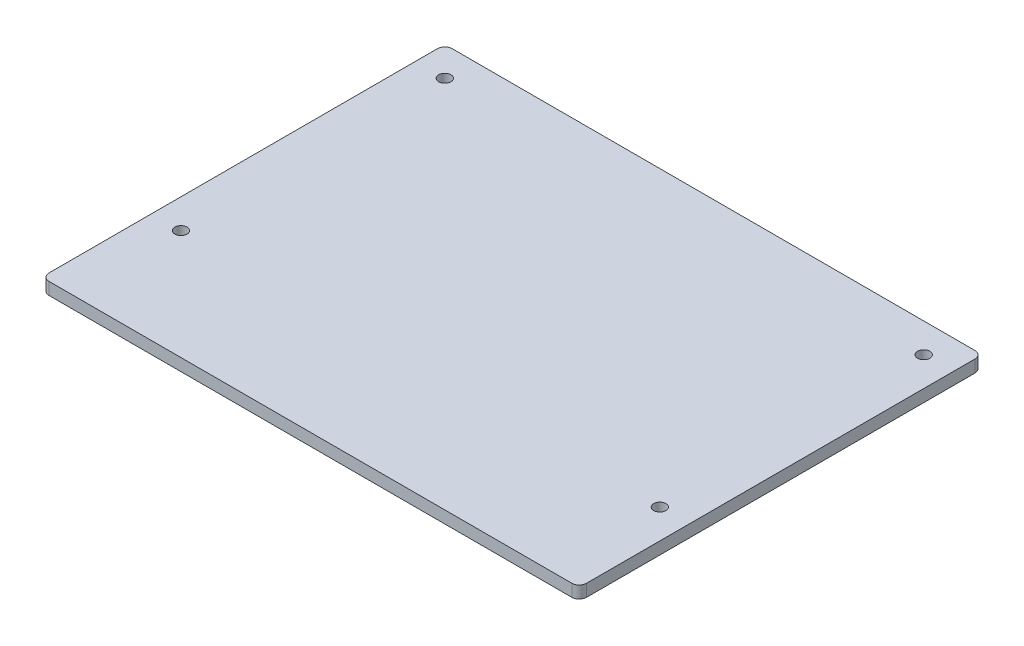
ISO-10303-21;
HEADER;
FILE_DESCRIPTION(('STEP AP214'),'2;1');
FILE_NAME('part.step','',(''),(''),'','','');
FILE_SCHEMA(('AUTOMOTIVE_DESIGN { 1 0 10303 214 1 1 1 1 }'));
ENDSEC;
DATA;
#1=APPLICATION_CONTEXT('core data for automotive mechanical design processes');
#2=APPLICATION_PROTOCOL_DEFINITION('international standard','automotive_design',2000,#1);
#3=PRODUCT_CONTEXT('',#1,'mechanical');
#4=PRODUCT('Part','Part','',(#3));
#5=PRODUCT_RELATED_PRODUCT_CATEGORY('part','',(#4));
#6=PRODUCT_DEFINITION_FORMATION('','',#4);
#7=PRODUCT_DEFINITION_CONTEXT('part definition',#1,'design');
#8=PRODUCT_DEFINITION('design','',#6,#7);
#9=PRODUCT_DEFINITION_SHAPE('','',#8);
#10=(LENGTH_UNIT() NAMED_UNIT(*) SI_UNIT(.MILLI.,.METRE.));
#11=(NAMED_UNIT(*) PLANE_ANGLE_UNIT() SI_UNIT($,.RADIAN.));
#12=(NAMED_UNIT(*) SI_UNIT($,.STERADIAN.) SOLID_ANGLE_UNIT());
#13=UNCERTAINTY_MEASURE_WITH_UNIT(LENGTH_MEASURE(1.E-05),#10,'distance_accuracy_value','');
#14=(GEOMETRIC_REPRESENTATION_CONTEXT(3) GLOBAL_UNCERTAINTY_ASSIGNED_CONTEXT((#13)) GLOBAL_UNIT_ASSIGNED_CONTEXT((#10,
#11,#12)) REPRESENTATION_CONTEXT('',''));
#15=CARTESIAN_POINT('',(0.,0.,0.));
#16=DIRECTION('',(0.,0.,1.));
#17=DIRECTION('',(1.,0.,0.));
#18=AXIS2_PLACEMENT_3D('',#15,#16,#17);
#19=CARTESIAN_POINT('',(-107.,5.,79.5));
#20=DIRECTION('',(0.,1.,0.));
#21=DIRECTION('',(0.,0.,1.));
#22=AXIS2_PLACEMENT_3D('',#19,#20,#21);
#23=PLANE('',#22);
#24=CARTESIAN_POINT('',(98.,5.,-70.5));
#25=DIRECTION('',(0.,1.,0.));
#26=DIRECTION('',(0.,0.,1.));
#27=AXIS2_PLACEMENT_3D('',#24,#25,#26);
#28=CIRCLE('',#27,2.5);
#29=CARTESIAN_POINT('',(98.,5.,-68.));
#30=VERTEX_POINT('',#29);
#31=EDGE_CURVE('E187',#30,#30,#28,.T.);
#32=ORIENTED_EDGE('',*,*,#31,.F.);
#33=EDGE_LOOP('',(#32));
#34=FACE_BOUND('',#33,.T.);
#35=CARTESIAN_POINT('',(-98.,5.,37.5));
#36=DIRECTION('',(0.,1.,0.));
#37=DIRECTION('',(0.,0.,1.));
#38=AXIS2_PLACEMENT_3D('',#35,#36,#37);
#39=CIRCLE('',#38,2.5);
#40=CARTESIAN_POINT('',(-98.,5.,40.));
#41=VERTEX_POINT('',#40);
#42=EDGE_CURVE('E133',#41,#41,#39,.T.);
#43=ORIENTED_EDGE('',*,*,#42,.F.);
#44=EDGE_LOOP('',(#43));
#45=FACE_BOUND('',#44,.T.);
#46=CARTESIAN_POINT('',(-107.,5.,79.5));
#47=DIRECTION('',(0.,1.,0.));
#48=DIRECTION('',(0.,0.,1.));
#49=AXIS2_PLACEMENT_3D('',#46,#47,#48);
#50=CIRCLE('',#49,3.);
#51=CARTESIAN_POINT('',(-110.,5.,79.5));
#52=VERTEX_POINT('',#51);
#53=CARTESIAN_POINT('',(-107.,5.,82.5));
#54=VERTEX_POINT('',#53);
#55=EDGE_CURVE('E144',#52,#54,#50,.T.);
#56=ORIENTED_EDGE('',*,*,#55,.T.);
#57=DIRECTION('',(1.,0.,0.));
#58=VECTOR('',#57,1.);
#59=CARTESIAN_POINT('',(-107.,5.,82.5));
#60=LINE('',#59,#58);
#61=CARTESIAN_POINT('',(107.,5.,82.5));
#62=VERTEX_POINT('',#61);
#63=EDGE_CURVE('E92',#54,#62,#60,.T.);
#64=ORIENTED_EDGE('',*,*,#63,.T.);
#65=CARTESIAN_POINT('',(107.,5.,79.5));
#66=DIRECTION('',(0.,1.,0.));
#67=DIRECTION('',(0.,0.,1.));
#68=AXIS2_PLACEMENT_3D('',#65,#66,#67);
#69=CIRCLE('',#68,3.);
#70=CARTESIAN_POINT('',(110.,5.,79.5));
#71=VERTEX_POINT('',#70);
#72=EDGE_CURVE('E159',#62,#71,#69,.T.);
#73=ORIENTED_EDGE('',*,*,#72,.T.);
#74=DIRECTION('',(0.,0.,-1.));
#75=VECTOR('',#74,1.);
#76=CARTESIAN_POINT('',(110.,5.,-79.5));
#77=LINE('',#76,#75);
#78=CARTESIAN_POINT('',(110.,5.,-79.5));
#79=VERTEX_POINT('',#78);
#80=EDGE_CURVE('E172',#71,#79,#77,.T.);
#81=ORIENTED_EDGE('',*,*,#80,.T.);
#82=CARTESIAN_POINT('',(107.,5.,-79.5));
#83=DIRECTION('',(0.,1.,0.));
#84=DIRECTION('',(0.,0.,1.));
#85=AXIS2_PLACEMENT_3D('',#82,#83,#84);
#86=CIRCLE('',#85,3.);
#87=CARTESIAN_POINT('',(107.,5.,-82.5));
#88=VERTEX_POINT('',#87);
#89=EDGE_CURVE('E111',#79,#88,#86,.T.);
#90=ORIENTED_EDGE('',*,*,#89,.T.);
#91=DIRECTION('',(-1.,0.,0.));
#92=VECTOR('',#91,1.);
#93=CARTESIAN_POINT('',(-107.,5.,-82.5));
#94=LINE('',#93,#92);
#95=CARTESIAN_POINT('',(-107.,5.,-82.5));
#96=VERTEX_POINT('',#95);
#97=EDGE_CURVE('E105',#88,#96,#94,.T.);
#98=ORIENTED_EDGE('',*,*,#97,.T.);
#99=CARTESIAN_POINT('',(-107.,5.,-79.5));
#100=DIRECTION('',(0.,1.,0.));
#101=DIRECTION('',(0.,0.,-1.));
#102=AXIS2_PLACEMENT_3D('',#99,#100,#101);
#103=CIRCLE('',#102,3.);
#104=CARTESIAN_POINT('',(-110.,5.,-79.5));
#105=VERTEX_POINT('',#104);
#106=EDGE_CURVE('E109',#96,#105,#103,.T.);
#107=ORIENTED_EDGE('',*,*,#106,.T.);
#108=DIRECTION('',(0.,0.,1.));
#109=VECTOR('',#108,1.);
#110=CARTESIAN_POINT('',(-110.,5.,-79.5));
#111=LINE('',#110,#109);
#112=EDGE_CURVE('E49',#105,#52,#111,.T.);
#113=ORIENTED_EDGE('',*,*,#112,.T.);
#114=EDGE_LOOP('',(#56,#64,#73,#81,#90,#98,#107,#113));
#115=FACE_BOUND('',#114,.T.);
#116=CARTESIAN_POINT('',(-98.,5.,-70.5));
#117=DIRECTION('',(0.,1.,0.));
#118=DIRECTION('',(0.,0.,-1.));
#119=AXIS2_PLACEMENT_3D('',#116,#117,#118);
#120=CIRCLE('',#119,2.50000000000001);
#121=CARTESIAN_POINT('',(-98.,5.,-73.));
#122=VERTEX_POINT('',#121);
#123=EDGE_CURVE('E181',#122,#122,#120,.T.);
#124=ORIENTED_EDGE('',*,*,#123,.F.);
#125=EDGE_LOOP('',(#124));
#126=FACE_BOUND('',#125,.T.);
#127=CARTESIAN_POINT('',(98.,5.,37.5));
#128=DIRECTION('',(0.,1.,0.));
#129=DIRECTION('',(0.,0.,-1.));
#130=AXIS2_PLACEMENT_3D('',#127,#128,#129);
#131=CIRCLE('',#130,2.5);
#132=CARTESIAN_POINT('',(98.,5.,35.));
#133=VERTEX_POINT('',#132);
#134=EDGE_CURVE('E193',#133,#133,#131,.T.);
#135=ORIENTED_EDGE('',*,*,#134,.F.);
#136=EDGE_LOOP('',(#135));
#137=FACE_BOUND('',#136,.T.);
#138=ADVANCED_FACE('F32',(#34,#45,#115,#126,#137),#23,.T.);
#139=CARTESIAN_POINT('',(-107.,0.,79.5));
#140=DIRECTION('',(0.,1.,0.));
#141=DIRECTION('',(0.,0.,1.));
#142=AXIS2_PLACEMENT_3D('',#139,#140,#141);
#143=PLANE('',#142);
#144=CARTESIAN_POINT('',(98.,0.,-70.5));
#145=DIRECTION('',(0.,1.,0.));
#146=DIRECTION('',(0.,0.,1.));
#147=AXIS2_PLACEMENT_3D('',#144,#145,#146);
#148=CIRCLE('',#147,2.5);
#149=CARTESIAN_POINT('',(98.,0.,-68.));
#150=VERTEX_POINT('',#149);
#151=EDGE_CURVE('E190',#150,#150,#148,.T.);
#152=ORIENTED_EDGE('',*,*,#151,.T.);
#153=EDGE_LOOP('',(#152));
#154=FACE_BOUND('',#153,.T.);
#155=CARTESIAN_POINT('',(-98.,0.,37.5));
#156=DIRECTION('',(0.,1.,0.));
#157=DIRECTION('',(0.,0.,1.));
#158=AXIS2_PLACEMENT_3D('',#155,#156,#157);
#159=CIRCLE('',#158,2.5);
#160=CARTESIAN_POINT('',(-98.,0.,40.));
#161=VERTEX_POINT('',#160);
#162=EDGE_CURVE('E178',#161,#161,#159,.T.);
#163=ORIENTED_EDGE('',*,*,#162,.T.);
#164=EDGE_LOOP('',(#163));
#165=FACE_BOUND('',#164,.T.);
#166=CARTESIAN_POINT('',(-107.,0.,79.5));
#167=DIRECTION('',(0.,1.,0.));
#168=DIRECTION('',(0.,0.,1.));
#169=AXIS2_PLACEMENT_3D('',#166,#167,#168);
#170=CIRCLE('',#169,3.);
#171=CARTESIAN_POINT('',(-110.,0.,79.5));
#172=VERTEX_POINT('',#171);
#173=CARTESIAN_POINT('',(-107.,0.,82.5));
#174=VERTEX_POINT('',#173);
#175=EDGE_CURVE('E129',#172,#174,#170,.T.);
#176=ORIENTED_EDGE('',*,*,#175,.F.);
#177=DIRECTION('',(0.,0.,1.));
#178=VECTOR('',#177,1.);
#179=CARTESIAN_POINT('',(-110.,0.,-79.5));
#180=LINE('',#179,#178);
#181=CARTESIAN_POINT('',(-110.,0.,-79.5));
#182=VERTEX_POINT('',#181);
#183=EDGE_CURVE('E84',#182,#172,#180,.T.);
#184=ORIENTED_EDGE('',*,*,#183,.F.);
#185=CARTESIAN_POINT('',(-107.,0.,-79.5));
#186=DIRECTION('',(0.,1.,0.));
#187=DIRECTION('',(0.,0.,-1.));
#188=AXIS2_PLACEMENT_3D('',#185,#186,#187);
#189=CIRCLE('',#188,3.);
#190=CARTESIAN_POINT('',(-107.,0.,-82.5));
#191=VERTEX_POINT('',#190);
#192=EDGE_CURVE('E78',#191,#182,#189,.T.);
#193=ORIENTED_EDGE('',*,*,#192,.F.);
#194=DIRECTION('',(-1.,0.,0.));
#195=VECTOR('',#194,1.);
#196=CARTESIAN_POINT('',(-107.,0.,-82.5));
#197=LINE('',#196,#195);
#198=CARTESIAN_POINT('',(107.,0.,-82.5));
#199=VERTEX_POINT('',#198);
#200=EDGE_CURVE('E119',#199,#191,#197,.T.);
#201=ORIENTED_EDGE('',*,*,#200,.F.);
#202=CARTESIAN_POINT('',(107.,0.,-79.5));
#203=DIRECTION('',(0.,1.,0.));
#204=DIRECTION('',(0.,0.,1.));
#205=AXIS2_PLACEMENT_3D('',#202,#203,#204);
#206=CIRCLE('',#205,3.);
#207=CARTESIAN_POINT('',(110.,0.,-79.5));
#208=VERTEX_POINT('',#207);
#209=EDGE_CURVE('E139',#208,#199,#206,.T.);
#210=ORIENTED_EDGE('',*,*,#209,.F.);
#211=DIRECTION('',(0.,0.,-1.));
#212=VECTOR('',#211,1.);
#213=CARTESIAN_POINT('',(110.,0.,-79.5));
#214=LINE('',#213,#212);
#215=CARTESIAN_POINT('',(110.,0.,79.5));
#216=VERTEX_POINT('',#215);
#217=EDGE_CURVE('E137',#216,#208,#214,.T.);
#218=ORIENTED_EDGE('',*,*,#217,.F.);
#219=CARTESIAN_POINT('',(107.,0.,79.5));
#220=DIRECTION('',(0.,1.,0.));
#221=DIRECTION('',(0.,0.,1.));
#222=AXIS2_PLACEMENT_3D('',#219,#220,#221);
#223=CIRCLE('',#222,3.);
#224=CARTESIAN_POINT('',(107.,0.,82.5));
#225=VERTEX_POINT('',#224);
#226=EDGE_CURVE('E135',#225,#216,#223,.T.);
#227=ORIENTED_EDGE('',*,*,#226,.F.);
#228=DIRECTION('',(1.,0.,0.));
#229=VECTOR('',#228,1.);
#230=CARTESIAN_POINT('',(-107.,0.,82.5));
#231=LINE('',#230,#229);
#232=EDGE_CURVE('E132',#174,#225,#231,.T.);
#233=ORIENTED_EDGE('',*,*,#232,.F.);
#234=EDGE_LOOP('',(#176,#184,#193,#201,#210,#218,#227,#233));
#235=FACE_BOUND('',#234,.T.);
#236=CARTESIAN_POINT('',(-98.,0.,-70.5));
#237=DIRECTION('',(0.,1.,0.));
#238=DIRECTION('',(0.,0.,-1.));
#239=AXIS2_PLACEMENT_3D('',#236,#237,#238);
#240=CIRCLE('',#239,2.50000000000001);
#241=CARTESIAN_POINT('',(-98.,0.,-73.));
#242=VERTEX_POINT('',#241);
#243=EDGE_CURVE('E184',#242,#242,#240,.T.);
#244=ORIENTED_EDGE('',*,*,#243,.T.);
#245=EDGE_LOOP('',(#244));
#246=FACE_BOUND('',#245,.T.);
#247=CARTESIAN_POINT('',(98.,0.,37.5));
#248=DIRECTION('',(0.,1.,0.));
#249=DIRECTION('',(0.,0.,-1.));
#250=AXIS2_PLACEMENT_3D('',#247,#248,#249);
#251=CIRCLE('',#250,2.5);
#252=CARTESIAN_POINT('',(98.,0.,35.));
#253=VERTEX_POINT('',#252);
#254=EDGE_CURVE('E196',#253,#253,#251,.T.);
#255=ORIENTED_EDGE('',*,*,#254,.T.);
#256=EDGE_LOOP('',(#255));
#257=FACE_BOUND('',#256,.T.);
#258=ADVANCED_FACE('F163',(#154,#165,#235,#246,#257),#143,.F.);
#259=CARTESIAN_POINT('',(-107.,5.,79.5));
#260=DIRECTION('',(0.,-1.,0.));
#261=DIRECTION('',(0.,0.,-1.));
#262=AXIS2_PLACEMENT_3D('',#259,#260,#261);
#263=CYLINDRICAL_SURFACE('',#262,3.);
#264=ORIENTED_EDGE('',*,*,#175,.T.);
#265=DIRECTION('',(0.,-1.,0.));
#266=VECTOR('',#265,1.);
#267=CARTESIAN_POINT('',(-107.,5.,82.5));
#268=LINE('',#267,#266);
#269=EDGE_CURVE('E11',#54,#174,#268,.T.);
#270=ORIENTED_EDGE('',*,*,#269,.F.);
#271=ORIENTED_EDGE('',*,*,#55,.F.);
#272=DIRECTION('',(0.,-1.,0.));
#273=VECTOR('',#272,1.);
#274=CARTESIAN_POINT('',(-110.,5.,79.5));
#275=LINE('',#274,#273);
#276=EDGE_CURVE('E125',#52,#172,#275,.T.);
#277=ORIENTED_EDGE('',*,*,#276,.T.);
#278=EDGE_LOOP('',(#264,#270,#271,#277));
#279=FACE_BOUND('',#278,.T.);
#280=ADVANCED_FACE('F34',(#279),#263,.T.);
#281=CARTESIAN_POINT('',(-107.,5.,82.5));
#282=DIRECTION('',(0.,0.,-1.));
#283=DIRECTION('',(-1.,0.,0.));
#284=AXIS2_PLACEMENT_3D('',#281,#282,#283);
#285=PLANE('',#284);
#286=ORIENTED_EDGE('',*,*,#232,.T.);
#287=DIRECTION('',(0.,-1.,0.));
#288=VECTOR('',#287,1.);
#289=CARTESIAN_POINT('',(107.,5.,82.5));
#290=LINE('',#289,#288);
#291=EDGE_CURVE('E41',#62,#225,#290,.T.);
#292=ORIENTED_EDGE('',*,*,#291,.F.);
#293=ORIENTED_EDGE('',*,*,#63,.F.);
#294=ORIENTED_EDGE('',*,*,#269,.T.);
#295=EDGE_LOOP('',(#286,#292,#293,#294));
#296=FACE_BOUND('',#295,.T.);
#297=ADVANCED_FACE('F231',(#296),#285,.F.);
#298=CARTESIAN_POINT('',(107.,5.,79.5));
#299=DIRECTION('',(0.,-1.,0.));
#300=DIRECTION('',(0.,0.,-1.));
#301=AXIS2_PLACEMENT_3D('',#298,#299,#300);
#302=CYLINDRICAL_SURFACE('',#301,3.);
#303=ORIENTED_EDGE('',*,*,#226,.T.);
#304=DIRECTION('',(0.,-1.,0.));
#305=VECTOR('',#304,1.);
#306=CARTESIAN_POINT('',(110.,5.,79.5));
#307=LINE('',#306,#305);
#308=EDGE_CURVE('E151',#71,#216,#307,.T.);
#309=ORIENTED_EDGE('',*,*,#308,.F.);
#310=ORIENTED_EDGE('',*,*,#72,.F.);
#311=ORIENTED_EDGE('',*,*,#291,.T.);
#312=EDGE_LOOP('',(#303,#309,#310,#311));
#313=FACE_BOUND('',#312,.T.);
#314=ADVANCED_FACE('F157',(#313),#302,.T.);
#315=CARTESIAN_POINT('',(110.,5.,-79.5));
#316=DIRECTION('',(-1.,0.,0.));
#317=DIRECTION('',(0.,0.,1.));
#318=AXIS2_PLACEMENT_3D('',#315,#316,#317);
#319=PLANE('',#318);
#320=ORIENTED_EDGE('',*,*,#217,.T.);
#321=DIRECTION('',(0.,-1.,0.));
#322=VECTOR('',#321,1.);
#323=CARTESIAN_POINT('',(110.,5.,-79.5));
#324=LINE('',#323,#322);
#325=EDGE_CURVE('E148',#79,#208,#324,.T.);
#326=ORIENTED_EDGE('',*,*,#325,.F.);
#327=ORIENTED_EDGE('',*,*,#80,.F.);
#328=ORIENTED_EDGE('',*,*,#308,.T.);
#329=EDGE_LOOP('',(#320,#326,#327,#328));
#330=FACE_BOUND('',#329,.T.);
#331=ADVANCED_FACE('F168',(#330),#319,.F.);
#332=CARTESIAN_POINT('',(107.,5.,-79.5));
#333=DIRECTION('',(0.,-1.,0.));
#334=DIRECTION('',(0.,0.,-1.));
#335=AXIS2_PLACEMENT_3D('',#332,#333,#334);
#336=CYLINDRICAL_SURFACE('',#335,3.);
#337=ORIENTED_EDGE('',*,*,#209,.T.);
#338=DIRECTION('',(0.,-1.,0.));
#339=VECTOR('',#338,1.);
#340=CARTESIAN_POINT('',(107.,5.,-82.5));
#341=LINE('',#340,#339);
#342=EDGE_CURVE('E120',#88,#199,#341,.T.);
#343=ORIENTED_EDGE('',*,*,#342,.F.);
#344=ORIENTED_EDGE('',*,*,#89,.F.);
#345=ORIENTED_EDGE('',*,*,#325,.T.);
#346=EDGE_LOOP('',(#337,#343,#344,#345));
#347=FACE_BOUND('',#346,.T.);
#348=ADVANCED_FACE('F171',(#347),#336,.T.);
#349=CARTESIAN_POINT('',(-107.,5.,-82.5));
#350=DIRECTION('',(0.,0.,1.));
#351=DIRECTION('',(1.,0.,0.));
#352=AXIS2_PLACEMENT_3D('',#349,#350,#351);
#353=PLANE('',#352);
#354=ORIENTED_EDGE('',*,*,#200,.T.);
#355=DIRECTION('',(0.,-1.,0.));
#356=VECTOR('',#355,1.);
#357=CARTESIAN_POINT('',(-107.,5.,-82.5));
#358=LINE('',#357,#356);
#359=EDGE_CURVE('E116',#96,#191,#358,.T.);
#360=ORIENTED_EDGE('',*,*,#359,.F.);
#361=ORIENTED_EDGE('',*,*,#97,.F.);
#362=ORIENTED_EDGE('',*,*,#342,.T.);
#363=EDGE_LOOP('',(#354,#360,#361,#362));
#364=FACE_BOUND('',#363,.T.);
#365=ADVANCED_FACE('F117',(#364),#353,.F.);
#366=CARTESIAN_POINT('',(-107.,5.,-79.5));
#367=DIRECTION('',(0.,-1.,0.));
#368=DIRECTION('',(0.,0.,-1.));
#369=AXIS2_PLACEMENT_3D('',#366,#367,#368);
#370=CYLINDRICAL_SURFACE('',#369,3.);
#371=ORIENTED_EDGE('',*,*,#192,.T.);
#372=DIRECTION('',(0.,-1.,0.));
#373=VECTOR('',#372,1.);
#374=CARTESIAN_POINT('',(-110.,5.,-79.5));
#375=LINE('',#374,#373);
#376=EDGE_CURVE('E121',#105,#182,#375,.T.);
#377=ORIENTED_EDGE('',*,*,#376,.F.);
#378=ORIENTED_EDGE('',*,*,#106,.F.);
#379=ORIENTED_EDGE('',*,*,#359,.T.);
#380=EDGE_LOOP('',(#371,#377,#378,#379));
#381=FACE_BOUND('',#380,.T.);
#382=ADVANCED_FACE('F123',(#381),#370,.T.);
#383=CARTESIAN_POINT('',(-110.,5.,-79.5));
#384=DIRECTION('',(1.,0.,0.));
#385=DIRECTION('',(0.,0.,-1.));
#386=AXIS2_PLACEMENT_3D('',#383,#384,#385);
#387=PLANE('',#386);
#388=ORIENTED_EDGE('',*,*,#183,.T.);
#389=ORIENTED_EDGE('',*,*,#276,.F.);
#390=ORIENTED_EDGE('',*,*,#112,.F.);
#391=ORIENTED_EDGE('',*,*,#376,.T.);
#392=EDGE_LOOP('',(#388,#389,#390,#391));
#393=FACE_BOUND('',#392,.T.);
#394=ADVANCED_FACE('F219',(#393),#387,.F.);
#395=CARTESIAN_POINT('',(-98.,5.,37.5));
#396=DIRECTION('',(0.,-1.,0.));
#397=DIRECTION('',(0.,0.,-1.));
#398=AXIS2_PLACEMENT_3D('',#395,#396,#397);
#399=CYLINDRICAL_SURFACE('',#398,2.5);
#400=ORIENTED_EDGE('',*,*,#42,.T.);
#401=EDGE_LOOP('',(#400));
#402=FACE_BOUND('',#401,.T.);
#403=ORIENTED_EDGE('',*,*,#162,.F.);
#404=EDGE_LOOP('',(#403));
#405=FACE_BOUND('',#404,.T.);
#406=ADVANCED_FACE('F216',(#402,#405),#399,.F.);
#407=CARTESIAN_POINT('',(-98.,5.,-70.5));
#408=DIRECTION('',(0.,-1.,0.));
#409=DIRECTION('',(0.,0.,-1.));
#410=AXIS2_PLACEMENT_3D('',#407,#408,#409);
#411=CYLINDRICAL_SURFACE('',#410,2.50000000000001);
#412=ORIENTED_EDGE('',*,*,#123,.T.);
#413=EDGE_LOOP('',(#412));
#414=FACE_BOUND('',#413,.T.);
#415=ORIENTED_EDGE('',*,*,#243,.F.);
#416=EDGE_LOOP('',(#415));
#417=FACE_BOUND('',#416,.T.);
#418=ADVANCED_FACE('F295',(#414,#417),#411,.F.);
#419=CARTESIAN_POINT('',(98.,5.,-70.5));
#420=DIRECTION('',(0.,-1.,0.));
#421=DIRECTION('',(0.,0.,-1.));
#422=AXIS2_PLACEMENT_3D('',#419,#420,#421);
#423=CYLINDRICAL_SURFACE('',#422,2.5);
#424=ORIENTED_EDGE('',*,*,#31,.T.);
#425=EDGE_LOOP('',(#424));
#426=FACE_BOUND('',#425,.T.);
#427=ORIENTED_EDGE('',*,*,#151,.F.);
#428=EDGE_LOOP('',(#427));
#429=FACE_BOUND('',#428,.T.);
#430=ADVANCED_FACE('F303',(#426,#429),#423,.F.);
#431=CARTESIAN_POINT('',(98.,5.,37.5));
#432=DIRECTION('',(0.,-1.,0.));
#433=DIRECTION('',(0.,0.,-1.));
#434=AXIS2_PLACEMENT_3D('',#431,#432,#433);
#435=CYLINDRICAL_SURFACE('',#434,2.5);
#436=ORIENTED_EDGE('',*,*,#134,.T.);
#437=EDGE_LOOP('',(#436));
#438=FACE_BOUND('',#437,.T.);
#439=ORIENTED_EDGE('',*,*,#254,.F.);
#440=EDGE_LOOP('',(#439));
#441=FACE_BOUND('',#440,.T.);
#442=ADVANCED_FACE('F202',(#438,#441),#435,.F.);
#443=CLOSED_SHELL('',(#138,#258,#280,#297,#314,#331,#348,#365,#382,#394,#406,#418,#430,#442));
#444=MANIFOLD_SOLID_BREP('B2',#443);
#445=ADVANCED_BREP_SHAPE_REPRESENTATION('',(#18,#444),#14);
#446=SHAPE_DEFINITION_REPRESENTATION(#9,#445);
ENDSEC;
END-ISO-10303-21;
